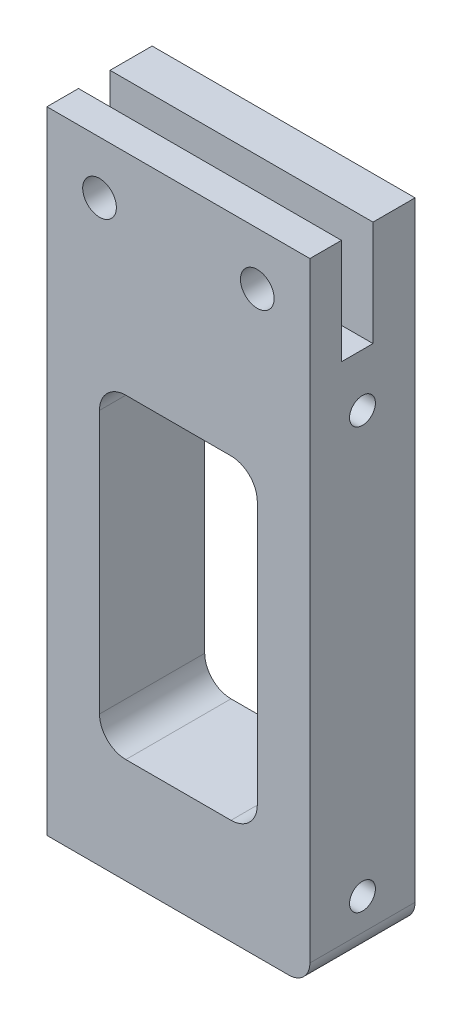
ISO-10303-21;
HEADER;
FILE_DESCRIPTION(('STEP AP214'),'2;1');
FILE_NAME('part.step','',(''),(''),'','','');
FILE_SCHEMA(('AUTOMOTIVE_DESIGN { 1 0 10303 214 1 1 1 1 }'));
ENDSEC;
DATA;
#1=APPLICATION_CONTEXT('core data for automotive mechanical design processes');
#2=APPLICATION_PROTOCOL_DEFINITION('international standard','automotive_design',2000,#1);
#3=PRODUCT_CONTEXT('',#1,'mechanical');
#4=PRODUCT('Part','Part','',(#3));
#5=PRODUCT_RELATED_PRODUCT_CATEGORY('part','',(#4));
#6=PRODUCT_DEFINITION_FORMATION('','',#4);
#7=PRODUCT_DEFINITION_CONTEXT('part definition',#1,'design');
#8=PRODUCT_DEFINITION('design','',#6,#7);
#9=PRODUCT_DEFINITION_SHAPE('','',#8);
#10=(LENGTH_UNIT() NAMED_UNIT(*) SI_UNIT(.MILLI.,.METRE.));
#11=(NAMED_UNIT(*) PLANE_ANGLE_UNIT() SI_UNIT($,.RADIAN.));
#12=(NAMED_UNIT(*) SI_UNIT($,.STERADIAN.) SOLID_ANGLE_UNIT());
#13=UNCERTAINTY_MEASURE_WITH_UNIT(LENGTH_MEASURE(1.E-05),#10,'distance_accuracy_value','');
#14=(GEOMETRIC_REPRESENTATION_CONTEXT(3) GLOBAL_UNCERTAINTY_ASSIGNED_CONTEXT((#13)) GLOBAL_UNIT_ASSIGNED_CONTEXT((#10,
#11,#12)) REPRESENTATION_CONTEXT('',''));
#15=CARTESIAN_POINT('',(0.,0.,0.));
#16=DIRECTION('',(0.,0.,1.));
#17=DIRECTION('',(1.,0.,0.));
#18=AXIS2_PLACEMENT_3D('',#15,#16,#17);
#19=CARTESIAN_POINT('',(2.50000000073669,20.,5.));
#20=DIRECTION('',(1.,0.,0.));
#21=DIRECTION('',(0.,1.,0.));
#22=AXIS2_PLACEMENT_3D('',#19,#20,#21);
#23=CONICAL_SURFACE('',#22,1.22949999951516,1.02974425728244);
#24=CARTESIAN_POINT('',(1.76124186782545,20.,5.00000000022283));
#25=VERTEX_POINT('',#24);
#26=VERTEX_LOOP('',#25);
#27=FACE_BOUND('',#26,.T.);
#28=CARTESIAN_POINT('',(2.49999999999999,20.,5.));
#29=DIRECTION('',(1.,0.,0.));
#30=DIRECTION('',(0.,1.,0.));
#31=AXIS2_PLACEMENT_3D('',#28,#29,#30);
#32=CIRCLE('',#31,1.2295);
#33=CARTESIAN_POINT('',(2.49999999999999,21.2295,5.));
#34=VERTEX_POINT('',#33);
#35=EDGE_CURVE('E157',#34,#34,#32,.T.);
#36=ORIENTED_EDGE('',*,*,#35,.T.);
#37=EDGE_LOOP('',(#36));
#38=FACE_BOUND('',#37,.T.);
#39=ADVANCED_FACE('F17',(#27,#38),#23,.F.);
#40=CARTESIAN_POINT('',(2.50000000073669,-20.,5.));
#41=DIRECTION('',(1.,0.,0.));
#42=DIRECTION('',(0.,1.,0.));
#43=AXIS2_PLACEMENT_3D('',#40,#41,#42);
#44=CONICAL_SURFACE('',#43,1.22949999951516,1.02974425728244);
#45=CARTESIAN_POINT('',(1.76124186782545,-20.,5.00000000022283));
#46=VERTEX_POINT('',#45);
#47=VERTEX_LOOP('',#46);
#48=FACE_BOUND('',#47,.T.);
#49=CARTESIAN_POINT('',(2.5,-20.,5.));
#50=DIRECTION('',(1.,0.,0.));
#51=DIRECTION('',(0.,1.,0.));
#52=AXIS2_PLACEMENT_3D('',#49,#50,#51);
#53=CIRCLE('',#52,1.2295);
#54=CARTESIAN_POINT('',(2.5,-18.7705,5.));
#55=VERTEX_POINT('',#54);
#56=EDGE_CURVE('E159',#55,#55,#53,.T.);
#57=ORIENTED_EDGE('',*,*,#56,.T.);
#58=EDGE_LOOP('',(#57));
#59=FACE_BOUND('',#58,.T.);
#60=ADVANCED_FACE('F154',(#48,#59),#44,.F.);
#61=CARTESIAN_POINT('',(-7.49999999999999,-15.0000000007253,5.));
#62=DIRECTION('',(0.,-1.,0.));
#63=DIRECTION('',(0.,0.,-1.));
#64=AXIS2_PLACEMENT_3D('',#61,#62,#63);
#65=CONICAL_SURFACE('',#64,1.22949999963111,1.02974425751025);
#66=CARTESIAN_POINT('',(-7.49999999987949,-14.2612418679846,5.));
#67=VERTEX_POINT('',#66);
#68=VERTEX_LOOP('',#67);
#69=FACE_BOUND('',#68,.T.);
#70=CARTESIAN_POINT('',(-7.49999999999999,-15.,5.));
#71=DIRECTION('',(0.,-1.,0.));
#72=DIRECTION('',(0.,0.,-1.));
#73=AXIS2_PLACEMENT_3D('',#70,#71,#72);
#74=CIRCLE('',#73,1.2295);
#75=CARTESIAN_POINT('',(-7.49999999999999,-15.,3.7705));
#76=VERTEX_POINT('',#75);
#77=EDGE_CURVE('E297',#76,#76,#74,.T.);
#78=ORIENTED_EDGE('',*,*,#77,.T.);
#79=EDGE_LOOP('',(#78));
#80=FACE_BOUND('',#79,.T.);
#81=ADVANCED_FACE('F672',(#69,#80),#65,.F.);
#82=CARTESIAN_POINT('',(-7.50000000000001,30.,7.));
#83=DIRECTION('',(0.,0.,1.));
#84=DIRECTION('',(1.,0.,0.));
#85=AXIS2_PLACEMENT_3D('',#82,#83,#84);
#86=CYLINDRICAL_SURFACE('',#85,1.6);
#87=CARTESIAN_POINT('',(-7.50000000000001,30.,10.));
#88=DIRECTION('',(0.,0.,1.));
#89=DIRECTION('',(1.,0.,0.));
#90=AXIS2_PLACEMENT_3D('',#87,#88,#89);
#91=CIRCLE('',#90,1.6);
#92=CARTESIAN_POINT('',(-5.90000000000001,30.,10.));
#93=VERTEX_POINT('',#92);
#94=EDGE_CURVE('E246',#93,#93,#91,.F.);
#95=ORIENTED_EDGE('',*,*,#94,.F.);
#96=EDGE_LOOP('',(#95));
#97=FACE_BOUND('',#96,.T.);
#98=CARTESIAN_POINT('',(-7.50000000000001,30.,7.));
#99=DIRECTION('',(0.,0.,1.));
#100=DIRECTION('',(1.,0.,0.));
#101=AXIS2_PLACEMENT_3D('',#98,#99,#100);
#102=CIRCLE('',#101,1.6);
#103=CARTESIAN_POINT('',(-5.90000000000001,30.,7.));
#104=VERTEX_POINT('',#103);
#105=EDGE_CURVE('E20',#104,#104,#102,.F.);
#106=ORIENTED_EDGE('',*,*,#105,.T.);
#107=EDGE_LOOP('',(#106));
#108=FACE_BOUND('',#107,.T.);
#109=ADVANCED_FACE('F260',(#97,#108),#86,.F.);
#110=CARTESIAN_POINT('',(7.49999999999999,30.,7.));
#111=DIRECTION('',(0.,0.,1.));
#112=DIRECTION('',(1.,0.,0.));
#113=AXIS2_PLACEMENT_3D('',#110,#111,#112);
#114=CYLINDRICAL_SURFACE('',#113,1.6);
#115=CARTESIAN_POINT('',(7.49999999999999,30.,10.));
#116=DIRECTION('',(0.,0.,1.));
#117=DIRECTION('',(1.,0.,0.));
#118=AXIS2_PLACEMENT_3D('',#115,#116,#117);
#119=CIRCLE('',#118,1.6);
#120=CARTESIAN_POINT('',(9.09999999999999,30.,10.));
#121=VERTEX_POINT('',#120);
#122=EDGE_CURVE('E242',#121,#121,#119,.F.);
#123=ORIENTED_EDGE('',*,*,#122,.F.);
#124=EDGE_LOOP('',(#123));
#125=FACE_BOUND('',#124,.T.);
#126=CARTESIAN_POINT('',(7.49999999999999,30.,7.));
#127=DIRECTION('',(0.,0.,1.));
#128=DIRECTION('',(1.,0.,0.));
#129=AXIS2_PLACEMENT_3D('',#126,#127,#128);
#130=CIRCLE('',#129,1.6);
#131=CARTESIAN_POINT('',(9.09999999999999,30.,7.));
#132=VERTEX_POINT('',#131);
#133=EDGE_CURVE('E249',#132,#132,#130,.F.);
#134=ORIENTED_EDGE('',*,*,#133,.T.);
#135=EDGE_LOOP('',(#134));
#136=FACE_BOUND('',#135,.T.);
#137=ADVANCED_FACE('F656',(#125,#136),#114,.F.);
#138=CARTESIAN_POINT('',(7.49999999999999,20.,5.));
#139=DIRECTION('',(1.,0.,0.));
#140=DIRECTION('',(0.,1.,0.));
#141=AXIS2_PLACEMENT_3D('',#138,#139,#140);
#142=CYLINDRICAL_SURFACE('',#141,1.2295);
#143=ORIENTED_EDGE('',*,*,#35,.F.);
#144=EDGE_LOOP('',(#143));
#145=FACE_BOUND('',#144,.T.);
#146=CARTESIAN_POINT('',(12.5,20.,5.));
#147=DIRECTION('',(1.,0.,0.));
#148=DIRECTION('',(0.,1.,0.));
#149=AXIS2_PLACEMENT_3D('',#146,#147,#148);
#150=CIRCLE('',#149,1.2295);
#151=CARTESIAN_POINT('',(12.5,21.2295,5.));
#152=VERTEX_POINT('',#151);
#153=EDGE_CURVE('E239',#152,#152,#150,.F.);
#154=ORIENTED_EDGE('',*,*,#153,.F.);
#155=EDGE_LOOP('',(#154));
#156=FACE_BOUND('',#155,.T.);
#157=ADVANCED_FACE('F647',(#145,#156),#142,.F.);
#158=CARTESIAN_POINT('',(7.5,-20.,5.));
#159=DIRECTION('',(1.,0.,0.));
#160=DIRECTION('',(0.,1.,0.));
#161=AXIS2_PLACEMENT_3D('',#158,#159,#160);
#162=CYLINDRICAL_SURFACE('',#161,1.2295);
#163=ORIENTED_EDGE('',*,*,#56,.F.);
#164=EDGE_LOOP('',(#163));
#165=FACE_BOUND('',#164,.T.);
#166=CARTESIAN_POINT('',(12.5,-20.,5.));
#167=DIRECTION('',(1.,0.,0.));
#168=DIRECTION('',(0.,1.,0.));
#169=AXIS2_PLACEMENT_3D('',#166,#167,#168);
#170=CIRCLE('',#169,1.2295);
#171=CARTESIAN_POINT('',(12.5,-18.7705,5.));
#172=VERTEX_POINT('',#171);
#173=EDGE_CURVE('E235',#172,#172,#170,.F.);
#174=ORIENTED_EDGE('',*,*,#173,.F.);
#175=EDGE_LOOP('',(#174));
#176=FACE_BOUND('',#175,.T.);
#177=ADVANCED_FACE('F266',(#165,#176),#162,.F.);
#178=CARTESIAN_POINT('',(-12.5,25.,7.));
#179=DIRECTION('',(0.,0.,1.));
#180=DIRECTION('',(1.,0.,0.));
#181=AXIS2_PLACEMENT_3D('',#178,#179,#180);
#182=PLANE('',#181);
#183=ORIENTED_EDGE('',*,*,#133,.F.);
#184=EDGE_LOOP('',(#183));
#185=FACE_BOUND('',#184,.T.);
#186=ORIENTED_EDGE('',*,*,#105,.F.);
#187=EDGE_LOOP('',(#186));
#188=FACE_BOUND('',#187,.T.);
#189=DIRECTION('',(1.,0.,0.));
#190=VECTOR('',#189,1.);
#191=CARTESIAN_POINT('',(-12.5,25.,7.));
#192=LINE('',#191,#190);
#193=CARTESIAN_POINT('',(12.5,25.,7.));
#194=VERTEX_POINT('',#193);
#195=CARTESIAN_POINT('',(-12.5,25.,7.));
#196=VERTEX_POINT('',#195);
#197=EDGE_CURVE('E251',#194,#196,#192,.F.);
#198=ORIENTED_EDGE('',*,*,#197,.T.);
#199=DIRECTION('',(0.,1.,0.));
#200=VECTOR('',#199,1.);
#201=CARTESIAN_POINT('',(-12.5,-25.,7.));
#202=LINE('',#201,#200);
#203=CARTESIAN_POINT('',(-12.5,35.,7.));
#204=VERTEX_POINT('',#203);
#205=EDGE_CURVE('E273',#204,#196,#202,.F.);
#206=ORIENTED_EDGE('',*,*,#205,.F.);
#207=DIRECTION('',(1.,0.,0.));
#208=VECTOR('',#207,1.);
#209=CARTESIAN_POINT('',(-12.5,35.,7.));
#210=LINE('',#209,#208);
#211=CARTESIAN_POINT('',(12.5,35.,7.));
#212=VERTEX_POINT('',#211);
#213=EDGE_CURVE('E255',#212,#204,#210,.F.);
#214=ORIENTED_EDGE('',*,*,#213,.F.);
#215=DIRECTION('',(0.,1.,0.));
#216=VECTOR('',#215,1.);
#217=CARTESIAN_POINT('',(12.5,35.,7.));
#218=LINE('',#217,#216);
#219=EDGE_CURVE('E170',#194,#212,#218,.T.);
#220=ORIENTED_EDGE('',*,*,#219,.F.);
#221=EDGE_LOOP('',(#198,#206,#214,#220));
#222=FACE_BOUND('',#221,.T.);
#223=ADVANCED_FACE('F262',(#185,#188,#222),#182,.F.);
#224=CARTESIAN_POINT('',(-12.5,25.,4.));
#225=DIRECTION('',(0.,-1.,0.));
#226=DIRECTION('',(0.,0.,-1.));
#227=AXIS2_PLACEMENT_3D('',#224,#225,#226);
#228=PLANE('',#227);
#229=DIRECTION('',(-1.,0.,0.));
#230=VECTOR('',#229,1.);
#231=CARTESIAN_POINT('',(-12.5,25.,4.));
#232=LINE('',#231,#230);
#233=CARTESIAN_POINT('',(12.5,25.,4.));
#234=VERTEX_POINT('',#233);
#235=CARTESIAN_POINT('',(-12.5,25.,4.));
#236=VERTEX_POINT('',#235);
#237=EDGE_CURVE('E245',#234,#236,#232,.T.);
#238=ORIENTED_EDGE('',*,*,#237,.T.);
#239=DIRECTION('',(0.,0.,1.));
#240=VECTOR('',#239,1.);
#241=CARTESIAN_POINT('',(-12.5,25.,0.));
#242=LINE('',#241,#240);
#243=EDGE_CURVE('E277',#196,#236,#242,.F.);
#244=ORIENTED_EDGE('',*,*,#243,.F.);
#245=ORIENTED_EDGE('',*,*,#197,.F.);
#246=DIRECTION('',(0.,0.,-1.));
#247=VECTOR('',#246,1.);
#248=CARTESIAN_POINT('',(12.5,25.,0.));
#249=LINE('',#248,#247);
#250=EDGE_CURVE('E174',#234,#194,#249,.F.);
#251=ORIENTED_EDGE('',*,*,#250,.F.);
#252=EDGE_LOOP('',(#238,#244,#245,#251));
#253=FACE_BOUND('',#252,.T.);
#254=ADVANCED_FACE('F265',(#253),#228,.F.);
#255=CARTESIAN_POINT('',(-12.5,35.,0.));
#256=DIRECTION('',(0.,1.,0.));
#257=DIRECTION('',(0.,0.,1.));
#258=AXIS2_PLACEMENT_3D('',#255,#256,#257);
#259=PLANE('',#258);
#260=DIRECTION('',(1.,0.,0.));
#261=VECTOR('',#260,1.);
#262=CARTESIAN_POINT('',(0.,35.,10.));
#263=LINE('',#262,#261);
#264=CARTESIAN_POINT('',(12.5,35.,10.));
#265=VERTEX_POINT('',#264);
#266=CARTESIAN_POINT('',(-12.5,35.,10.));
#267=VERTEX_POINT('',#266);
#268=EDGE_CURVE('E248',#265,#267,#263,.F.);
#269=ORIENTED_EDGE('',*,*,#268,.F.);
#270=DIRECTION('',(0.,0.,-1.));
#271=VECTOR('',#270,1.);
#272=CARTESIAN_POINT('',(12.5,35.,0.));
#273=LINE('',#272,#271);
#274=EDGE_CURVE('E168',#212,#265,#273,.F.);
#275=ORIENTED_EDGE('',*,*,#274,.F.);
#276=ORIENTED_EDGE('',*,*,#213,.T.);
#277=DIRECTION('',(0.,0.,1.));
#278=VECTOR('',#277,1.);
#279=CARTESIAN_POINT('',(-12.5,35.,0.));
#280=LINE('',#279,#278);
#281=EDGE_CURVE('E313',#267,#204,#280,.F.);
#282=ORIENTED_EDGE('',*,*,#281,.F.);
#283=EDGE_LOOP('',(#269,#275,#276,#282));
#284=FACE_BOUND('',#283,.T.);
#285=ADVANCED_FACE('F618',(#284),#259,.T.);
#286=CARTESIAN_POINT('',(-7.49999999999999,-20.,5.));
#287=DIRECTION('',(0.,-1.,0.));
#288=DIRECTION('',(0.,0.,-1.));
#289=AXIS2_PLACEMENT_3D('',#286,#287,#288);
#290=CYLINDRICAL_SURFACE('',#289,1.2295);
#291=ORIENTED_EDGE('',*,*,#77,.F.);
#292=EDGE_LOOP('',(#291));
#293=FACE_BOUND('',#292,.T.);
#294=CARTESIAN_POINT('',(-7.49999999999999,-25.,5.));
#295=DIRECTION('',(0.,-1.,0.));
#296=DIRECTION('',(0.,0.,-1.));
#297=AXIS2_PLACEMENT_3D('',#294,#295,#296);
#298=CIRCLE('',#297,1.2295);
#299=CARTESIAN_POINT('',(-7.49999999999999,-25.,3.7705));
#300=VERTEX_POINT('',#299);
#301=EDGE_CURVE('E231',#300,#300,#298,.F.);
#302=ORIENTED_EDGE('',*,*,#301,.F.);
#303=EDGE_LOOP('',(#302));
#304=FACE_BOUND('',#303,.T.);
#305=ADVANCED_FACE('F428',(#293,#304),#290,.F.);
#306=CARTESIAN_POINT('',(0.,5.,10.));
#307=DIRECTION('',(0.,0.,1.));
#308=DIRECTION('',(1.,0.,0.));
#309=AXIS2_PLACEMENT_3D('',#306,#307,#308);
#310=PLANE('',#309);
#311=DIRECTION('',(0.,1.,0.));
#312=VECTOR('',#311,1.);
#313=CARTESIAN_POINT('',(-7.5,-12.5,10.));
#314=LINE('',#313,#312);
#315=CARTESIAN_POINT('',(-7.5,-12.5,10.));
#316=VERTEX_POINT('',#315);
#317=CARTESIAN_POINT('',(-7.5,12.5,10.));
#318=VERTEX_POINT('',#317);
#319=EDGE_CURVE('E338',#316,#318,#314,.T.);
#320=ORIENTED_EDGE('',*,*,#319,.T.);
#321=CARTESIAN_POINT('',(-5.00000000000001,12.5,10.));
#322=DIRECTION('',(0.,0.,1.));
#323=DIRECTION('',(1.,0.,0.));
#324=AXIS2_PLACEMENT_3D('',#321,#322,#323);
#325=CIRCLE('',#324,2.5);
#326=CARTESIAN_POINT('',(-5.00000000000001,15.,10.));
#327=VERTEX_POINT('',#326);
#328=EDGE_CURVE('E212',#318,#327,#325,.F.);
#329=ORIENTED_EDGE('',*,*,#328,.T.);
#330=DIRECTION('',(1.,0.,0.));
#331=VECTOR('',#330,1.);
#332=CARTESIAN_POINT('',(-5.00000000000001,15.,10.));
#333=LINE('',#332,#331);
#334=CARTESIAN_POINT('',(4.99999999999999,15.,10.));
#335=VERTEX_POINT('',#334);
#336=EDGE_CURVE('E211',#327,#335,#333,.T.);
#337=ORIENTED_EDGE('',*,*,#336,.T.);
#338=CARTESIAN_POINT('',(5.,12.5,10.));
#339=DIRECTION('',(0.,0.,1.));
#340=DIRECTION('',(1.,0.,0.));
#341=AXIS2_PLACEMENT_3D('',#338,#339,#340);
#342=CIRCLE('',#341,2.5);
#343=CARTESIAN_POINT('',(7.5,12.5,10.));
#344=VERTEX_POINT('',#343);
#345=EDGE_CURVE('E224',#335,#344,#342,.F.);
#346=ORIENTED_EDGE('',*,*,#345,.T.);
#347=DIRECTION('',(0.,1.,0.));
#348=VECTOR('',#347,1.);
#349=CARTESIAN_POINT('',(7.5,12.5,10.));
#350=LINE('',#349,#348);
#351=CARTESIAN_POINT('',(7.5,-12.5,10.));
#352=VERTEX_POINT('',#351);
#353=EDGE_CURVE('E334',#344,#352,#350,.F.);
#354=ORIENTED_EDGE('',*,*,#353,.T.);
#355=CARTESIAN_POINT('',(5.00000000000001,-12.5,10.));
#356=DIRECTION('',(0.,0.,1.));
#357=DIRECTION('',(1.,0.,0.));
#358=AXIS2_PLACEMENT_3D('',#355,#356,#357);
#359=CIRCLE('',#358,2.49999999999999);
#360=CARTESIAN_POINT('',(5.00000000000001,-15.,10.));
#361=VERTEX_POINT('',#360);
#362=EDGE_CURVE('E220',#352,#361,#359,.F.);
#363=ORIENTED_EDGE('',*,*,#362,.T.);
#364=DIRECTION('',(1.,0.,0.));
#365=VECTOR('',#364,1.);
#366=CARTESIAN_POINT('',(5.00000000000001,-15.,10.));
#367=LINE('',#366,#365);
#368=CARTESIAN_POINT('',(-5.,-15.,10.));
#369=VERTEX_POINT('',#368);
#370=EDGE_CURVE('E336',#361,#369,#367,.F.);
#371=ORIENTED_EDGE('',*,*,#370,.T.);
#372=CARTESIAN_POINT('',(-5.,-12.5,10.));
#373=DIRECTION('',(0.,0.,1.));
#374=DIRECTION('',(1.,0.,0.));
#375=AXIS2_PLACEMENT_3D('',#372,#373,#374);
#376=CIRCLE('',#375,2.5);
#377=EDGE_CURVE('E216',#369,#316,#376,.F.);
#378=ORIENTED_EDGE('',*,*,#377,.T.);
#379=EDGE_LOOP('',(#320,#329,#337,#346,#354,#363,#371,#378));
#380=FACE_BOUND('',#379,.T.);
#381=ORIENTED_EDGE('',*,*,#122,.T.);
#382=EDGE_LOOP('',(#381));
#383=FACE_BOUND('',#382,.T.);
#384=ORIENTED_EDGE('',*,*,#94,.T.);
#385=EDGE_LOOP('',(#384));
#386=FACE_BOUND('',#385,.T.);
#387=DIRECTION('',(0.,1.,0.));
#388=VECTOR('',#387,1.);
#389=CARTESIAN_POINT('',(-12.5,-25.,10.));
#390=LINE('',#389,#388);
#391=CARTESIAN_POINT('',(-12.5,-25.,10.));
#392=VERTEX_POINT('',#391);
#393=EDGE_CURVE('E316',#392,#267,#390,.T.);
#394=ORIENTED_EDGE('',*,*,#393,.F.);
#395=DIRECTION('',(1.,0.,0.));
#396=VECTOR('',#395,1.);
#397=CARTESIAN_POINT('',(12.5,-25.,10.));
#398=LINE('',#397,#396);
#399=CARTESIAN_POINT('',(10.5,-25.,10.));
#400=VERTEX_POINT('',#399);
#401=EDGE_CURVE('E107',#400,#392,#398,.F.);
#402=ORIENTED_EDGE('',*,*,#401,.F.);
#403=CARTESIAN_POINT('',(10.5,-23.,10.));
#404=DIRECTION('',(0.,0.,1.));
#405=DIRECTION('',(1.,0.,0.));
#406=AXIS2_PLACEMENT_3D('',#403,#404,#405);
#407=CIRCLE('',#406,2.);
#408=CARTESIAN_POINT('',(12.5,-23.,10.));
#409=VERTEX_POINT('',#408);
#410=EDGE_CURVE('E228',#409,#400,#407,.F.);
#411=ORIENTED_EDGE('',*,*,#410,.F.);
#412=DIRECTION('',(0.,1.,0.));
#413=VECTOR('',#412,1.);
#414=CARTESIAN_POINT('',(12.5,35.,10.));
#415=LINE('',#414,#413);
#416=EDGE_CURVE('E97',#265,#409,#415,.F.);
#417=ORIENTED_EDGE('',*,*,#416,.F.);
#418=ORIENTED_EDGE('',*,*,#268,.T.);
#419=EDGE_LOOP('',(#394,#402,#411,#417,#418));
#420=FACE_BOUND('',#419,.T.);
#421=ADVANCED_FACE('F424',(#380,#383,#386,#420),#310,.T.);
#422=CARTESIAN_POINT('',(-12.5,35.,4.));
#423=DIRECTION('',(0.,0.,-1.));
#424=DIRECTION('',(-1.,0.,0.));
#425=AXIS2_PLACEMENT_3D('',#422,#423,#424);
#426=PLANE('',#425);
#427=CARTESIAN_POINT('',(7.49999999999999,30.,4.));
#428=DIRECTION('',(0.,0.,1.));
#429=DIRECTION('',(1.,0.,0.));
#430=AXIS2_PLACEMENT_3D('',#427,#428,#429);
#431=CIRCLE('',#430,1.2295);
#432=CARTESIAN_POINT('',(8.72949999999999,30.,4.));
#433=VERTEX_POINT('',#432);
#434=EDGE_CURVE('E208',#433,#433,#431,.F.);
#435=ORIENTED_EDGE('',*,*,#434,.T.);
#436=EDGE_LOOP('',(#435));
#437=FACE_BOUND('',#436,.T.);
#438=CARTESIAN_POINT('',(-7.50000000000001,30.,4.));
#439=DIRECTION('',(0.,0.,1.));
#440=DIRECTION('',(1.,0.,0.));
#441=AXIS2_PLACEMENT_3D('',#438,#439,#440);
#442=CIRCLE('',#441,1.2295);
#443=CARTESIAN_POINT('',(-6.27050000000001,30.,4.));
#444=VERTEX_POINT('',#443);
#445=EDGE_CURVE('E204',#444,#444,#442,.F.);
#446=ORIENTED_EDGE('',*,*,#445,.T.);
#447=EDGE_LOOP('',(#446));
#448=FACE_BOUND('',#447,.T.);
#449=DIRECTION('',(1.,0.,0.));
#450=VECTOR('',#449,1.);
#451=CARTESIAN_POINT('',(-12.5,35.,4.));
#452=LINE('',#451,#450);
#453=CARTESIAN_POINT('',(-12.5,35.,4.));
#454=VERTEX_POINT('',#453);
#455=CARTESIAN_POINT('',(12.5,35.,4.));
#456=VERTEX_POINT('',#455);
#457=EDGE_CURVE('E238',#454,#456,#452,.T.);
#458=ORIENTED_EDGE('',*,*,#457,.F.);
#459=DIRECTION('',(0.,1.,0.));
#460=VECTOR('',#459,1.);
#461=CARTESIAN_POINT('',(-12.5,-25.,4.));
#462=LINE('',#461,#460);
#463=EDGE_CURVE('E280',#236,#454,#462,.T.);
#464=ORIENTED_EDGE('',*,*,#463,.F.);
#465=ORIENTED_EDGE('',*,*,#237,.F.);
#466=DIRECTION('',(0.,1.,0.));
#467=VECTOR('',#466,1.);
#468=CARTESIAN_POINT('',(12.5,35.,4.));
#469=LINE('',#468,#467);
#470=EDGE_CURVE('E179',#456,#234,#469,.F.);
#471=ORIENTED_EDGE('',*,*,#470,.F.);
#472=EDGE_LOOP('',(#458,#464,#465,#471));
#473=FACE_BOUND('',#472,.T.);
#474=ADVANCED_FACE('F427',(#437,#448,#473),#426,.F.);
#475=CARTESIAN_POINT('',(12.5,35.,0.));
#476=DIRECTION('',(1.,0.,0.));
#477=DIRECTION('',(0.,0.,-1.));
#478=AXIS2_PLACEMENT_3D('',#475,#476,#477);
#479=PLANE('',#478);
#480=ORIENTED_EDGE('',*,*,#173,.T.);
#481=EDGE_LOOP('',(#480));
#482=FACE_BOUND('',#481,.T.);
#483=ORIENTED_EDGE('',*,*,#153,.T.);
#484=EDGE_LOOP('',(#483));
#485=FACE_BOUND('',#484,.T.);
#486=ORIENTED_EDGE('',*,*,#274,.T.);
#487=ORIENTED_EDGE('',*,*,#416,.T.);
#488=DIRECTION('',(0.,0.,1.));
#489=VECTOR('',#488,1.);
#490=CARTESIAN_POINT('',(12.5,-23.,0.));
#491=LINE('',#490,#489);
#492=CARTESIAN_POINT('',(12.5,-23.,0.));
#493=VERTEX_POINT('',#492);
#494=EDGE_CURVE('E227',#493,#409,#491,.T.);
#495=ORIENTED_EDGE('',*,*,#494,.F.);
#496=DIRECTION('',(0.,1.,0.));
#497=VECTOR('',#496,1.);
#498=CARTESIAN_POINT('',(12.5,5.,0.));
#499=LINE('',#498,#497);
#500=CARTESIAN_POINT('',(12.5,35.,0.));
#501=VERTEX_POINT('',#500);
#502=EDGE_CURVE('E207',#493,#501,#499,.T.);
#503=ORIENTED_EDGE('',*,*,#502,.T.);
#504=DIRECTION('',(0.,0.,1.));
#505=VECTOR('',#504,1.);
#506=CARTESIAN_POINT('',(12.5,35.,0.));
#507=LINE('',#506,#505);
#508=EDGE_CURVE('E284',#456,#501,#507,.F.);
#509=ORIENTED_EDGE('',*,*,#508,.F.);
#510=ORIENTED_EDGE('',*,*,#470,.T.);
#511=ORIENTED_EDGE('',*,*,#250,.T.);
#512=ORIENTED_EDGE('',*,*,#219,.T.);
#513=EDGE_LOOP('',(#486,#487,#495,#503,#509,#510,#511,#512));
#514=FACE_BOUND('',#513,.T.);
#515=ADVANCED_FACE('F446',(#482,#485,#514),#479,.T.);
#516=CARTESIAN_POINT('',(-12.5,35.,0.));
#517=DIRECTION('',(0.,1.,0.));
#518=DIRECTION('',(0.,0.,1.));
#519=AXIS2_PLACEMENT_3D('',#516,#517,#518);
#520=PLANE('',#519);
#521=DIRECTION('',(1.,0.,0.));
#522=VECTOR('',#521,1.);
#523=CARTESIAN_POINT('',(0.,35.,0.));
#524=LINE('',#523,#522);
#525=CARTESIAN_POINT('',(-12.5,35.,0.));
#526=VERTEX_POINT('',#525);
#527=EDGE_CURVE('E347',#501,#526,#524,.F.);
#528=ORIENTED_EDGE('',*,*,#527,.T.);
#529=DIRECTION('',(0.,0.,1.));
#530=VECTOR('',#529,1.);
#531=CARTESIAN_POINT('',(-12.5,35.,0.));
#532=LINE('',#531,#530);
#533=EDGE_CURVE('E282',#454,#526,#532,.F.);
#534=ORIENTED_EDGE('',*,*,#533,.F.);
#535=ORIENTED_EDGE('',*,*,#457,.T.);
#536=ORIENTED_EDGE('',*,*,#508,.T.);
#537=EDGE_LOOP('',(#528,#534,#535,#536));
#538=FACE_BOUND('',#537,.T.);
#539=ADVANCED_FACE('F448',(#538),#520,.T.);
#540=CARTESIAN_POINT('',(-12.5,-25.,0.));
#541=DIRECTION('',(-1.,0.,0.));
#542=DIRECTION('',(0.,0.,1.));
#543=AXIS2_PLACEMENT_3D('',#540,#541,#542);
#544=PLANE('',#543);
#545=ORIENTED_EDGE('',*,*,#393,.T.);
#546=ORIENTED_EDGE('',*,*,#281,.T.);
#547=ORIENTED_EDGE('',*,*,#205,.T.);
#548=ORIENTED_EDGE('',*,*,#243,.T.);
#549=ORIENTED_EDGE('',*,*,#463,.T.);
#550=ORIENTED_EDGE('',*,*,#533,.T.);
#551=DIRECTION('',(0.,1.,0.));
#552=VECTOR('',#551,1.);
#553=CARTESIAN_POINT('',(-12.5,5.,0.));
#554=LINE('',#553,#552);
#555=CARTESIAN_POINT('',(-12.5,-25.,0.));
#556=VERTEX_POINT('',#555);
#557=EDGE_CURVE('E350',#526,#556,#554,.F.);
#558=ORIENTED_EDGE('',*,*,#557,.T.);
#559=DIRECTION('',(0.,0.,-1.));
#560=VECTOR('',#559,1.);
#561=CARTESIAN_POINT('',(-12.5,-25.,0.));
#562=LINE('',#561,#560);
#563=EDGE_CURVE('E234',#392,#556,#562,.T.);
#564=ORIENTED_EDGE('',*,*,#563,.F.);
#565=EDGE_LOOP('',(#545,#546,#547,#548,#549,#550,#558,#564));
#566=FACE_BOUND('',#565,.T.);
#567=ADVANCED_FACE('F438',(#566),#544,.T.);
#568=CARTESIAN_POINT('',(12.5,-25.,0.));
#569=DIRECTION('',(0.,-1.,0.));
#570=DIRECTION('',(0.,0.,-1.));
#571=AXIS2_PLACEMENT_3D('',#568,#569,#570);
#572=PLANE('',#571);
#573=ORIENTED_EDGE('',*,*,#301,.T.);
#574=EDGE_LOOP('',(#573));
#575=FACE_BOUND('',#574,.T.);
#576=ORIENTED_EDGE('',*,*,#563,.T.);
#577=DIRECTION('',(1.,0.,0.));
#578=VECTOR('',#577,1.);
#579=CARTESIAN_POINT('',(0.,-25.,0.));
#580=LINE('',#579,#578);
#581=CARTESIAN_POINT('',(10.5,-25.,0.));
#582=VERTEX_POINT('',#581);
#583=EDGE_CURVE('E203',#556,#582,#580,.T.);
#584=ORIENTED_EDGE('',*,*,#583,.T.);
#585=DIRECTION('',(0.,0.,1.));
#586=VECTOR('',#585,1.);
#587=CARTESIAN_POINT('',(10.5,-25.,0.));
#588=LINE('',#587,#586);
#589=EDGE_CURVE('E230',#400,#582,#588,.F.);
#590=ORIENTED_EDGE('',*,*,#589,.F.);
#591=ORIENTED_EDGE('',*,*,#401,.T.);
#592=EDGE_LOOP('',(#576,#584,#590,#591));
#593=FACE_BOUND('',#592,.T.);
#594=ADVANCED_FACE('F441',(#575,#593),#572,.T.);
#595=CARTESIAN_POINT('',(10.5,-23.,0.));
#596=DIRECTION('',(0.,0.,1.));
#597=DIRECTION('',(1.,0.,0.));
#598=AXIS2_PLACEMENT_3D('',#595,#596,#597);
#599=CYLINDRICAL_SURFACE('',#598,2.);
#600=CARTESIAN_POINT('',(10.5,-23.,0.));
#601=DIRECTION('',(0.,0.,1.));
#602=DIRECTION('',(1.,0.,0.));
#603=AXIS2_PLACEMENT_3D('',#600,#601,#602);
#604=CIRCLE('',#603,2.);
#605=EDGE_CURVE('E200',#582,#493,#604,.T.);
#606=ORIENTED_EDGE('',*,*,#605,.T.);
#607=ORIENTED_EDGE('',*,*,#494,.T.);
#608=ORIENTED_EDGE('',*,*,#410,.T.);
#609=ORIENTED_EDGE('',*,*,#589,.T.);
#610=EDGE_LOOP('',(#606,#607,#608,#609));
#611=FACE_BOUND('',#610,.T.);
#612=ADVANCED_FACE('F445',(#611),#599,.T.);
#613=CARTESIAN_POINT('',(5.,12.5,0.));
#614=DIRECTION('',(0.,0.,1.));
#615=DIRECTION('',(1.,0.,0.));
#616=AXIS2_PLACEMENT_3D('',#613,#614,#615);
#617=CYLINDRICAL_SURFACE('',#616,2.5);
#618=DIRECTION('',(0.,0.,1.));
#619=VECTOR('',#618,1.);
#620=CARTESIAN_POINT('',(4.99999999999999,15.,0.));
#621=LINE('',#620,#619);
#622=CARTESIAN_POINT('',(4.99999999999999,15.,0.));
#623=VERTEX_POINT('',#622);
#624=EDGE_CURVE('E214',#335,#623,#621,.F.);
#625=ORIENTED_EDGE('',*,*,#624,.T.);
#626=CARTESIAN_POINT('',(5.,12.5,0.));
#627=DIRECTION('',(0.,0.,1.));
#628=DIRECTION('',(1.,0.,0.));
#629=AXIS2_PLACEMENT_3D('',#626,#627,#628);
#630=CIRCLE('',#629,2.5);
#631=CARTESIAN_POINT('',(7.5,12.5,0.));
#632=VERTEX_POINT('',#631);
#633=EDGE_CURVE('E197',#623,#632,#630,.F.);
#634=ORIENTED_EDGE('',*,*,#633,.T.);
#635=DIRECTION('',(0.,0.,-1.));
#636=VECTOR('',#635,1.);
#637=CARTESIAN_POINT('',(7.5,12.5,0.));
#638=LINE('',#637,#636);
#639=EDGE_CURVE('E226',#632,#344,#638,.F.);
#640=ORIENTED_EDGE('',*,*,#639,.T.);
#641=ORIENTED_EDGE('',*,*,#345,.F.);
#642=EDGE_LOOP('',(#625,#634,#640,#641));
#643=FACE_BOUND('',#642,.T.);
#644=ADVANCED_FACE('F422',(#643),#617,.F.);
#645=CARTESIAN_POINT('',(7.5,12.5,0.));
#646=DIRECTION('',(1.,0.,0.));
#647=DIRECTION('',(0.,0.,-1.));
#648=AXIS2_PLACEMENT_3D('',#645,#646,#647);
#649=PLANE('',#648);
#650=ORIENTED_EDGE('',*,*,#639,.F.);
#651=DIRECTION('',(0.,1.,0.));
#652=VECTOR('',#651,1.);
#653=CARTESIAN_POINT('',(7.5,5.,0.));
#654=LINE('',#653,#652);
#655=CARTESIAN_POINT('',(7.5,-12.5,0.));
#656=VERTEX_POINT('',#655);
#657=EDGE_CURVE('E196',#632,#656,#654,.F.);
#658=ORIENTED_EDGE('',*,*,#657,.T.);
#659=DIRECTION('',(0.,0.,1.));
#660=VECTOR('',#659,1.);
#661=CARTESIAN_POINT('',(7.5,-12.5,0.));
#662=LINE('',#661,#660);
#663=EDGE_CURVE('E223',#656,#352,#662,.T.);
#664=ORIENTED_EDGE('',*,*,#663,.T.);
#665=ORIENTED_EDGE('',*,*,#353,.F.);
#666=EDGE_LOOP('',(#650,#658,#664,#665));
#667=FACE_BOUND('',#666,.T.);
#668=ADVANCED_FACE('F420',(#667),#649,.F.);
#669=CARTESIAN_POINT('',(5.00000000000001,-12.5,0.));
#670=DIRECTION('',(0.,0.,1.));
#671=DIRECTION('',(1.,0.,0.));
#672=AXIS2_PLACEMENT_3D('',#669,#670,#671);
#673=CYLINDRICAL_SURFACE('',#672,2.49999999999999);
#674=ORIENTED_EDGE('',*,*,#663,.F.);
#675=CARTESIAN_POINT('',(5.00000000000001,-12.5,0.));
#676=DIRECTION('',(0.,0.,1.));
#677=DIRECTION('',(1.,0.,0.));
#678=AXIS2_PLACEMENT_3D('',#675,#676,#677);
#679=CIRCLE('',#678,2.49999999999999);
#680=CARTESIAN_POINT('',(5.00000000000001,-15.,0.));
#681=VERTEX_POINT('',#680);
#682=EDGE_CURVE('E193',#656,#681,#679,.F.);
#683=ORIENTED_EDGE('',*,*,#682,.T.);
#684=DIRECTION('',(0.,0.,-1.));
#685=VECTOR('',#684,1.);
#686=CARTESIAN_POINT('',(5.00000000000001,-15.,0.));
#687=LINE('',#686,#685);
#688=EDGE_CURVE('E222',#681,#361,#687,.F.);
#689=ORIENTED_EDGE('',*,*,#688,.T.);
#690=ORIENTED_EDGE('',*,*,#362,.F.);
#691=EDGE_LOOP('',(#674,#683,#689,#690));
#692=FACE_BOUND('',#691,.T.);
#693=ADVANCED_FACE('F416',(#692),#673,.F.);
#694=CARTESIAN_POINT('',(5.00000000000001,-15.,0.));
#695=DIRECTION('',(0.,-1.,0.));
#696=DIRECTION('',(0.,0.,-1.));
#697=AXIS2_PLACEMENT_3D('',#694,#695,#696);
#698=PLANE('',#697);
#699=ORIENTED_EDGE('',*,*,#688,.F.);
#700=DIRECTION('',(1.,0.,0.));
#701=VECTOR('',#700,1.);
#702=CARTESIAN_POINT('',(0.,-15.,0.));
#703=LINE('',#702,#701);
#704=CARTESIAN_POINT('',(-5.,-15.,0.));
#705=VERTEX_POINT('',#704);
#706=EDGE_CURVE('E192',#681,#705,#703,.F.);
#707=ORIENTED_EDGE('',*,*,#706,.T.);
#708=DIRECTION('',(0.,0.,1.));
#709=VECTOR('',#708,1.);
#710=CARTESIAN_POINT('',(-5.,-15.,0.));
#711=LINE('',#710,#709);
#712=EDGE_CURVE('E219',#705,#369,#711,.T.);
#713=ORIENTED_EDGE('',*,*,#712,.T.);
#714=ORIENTED_EDGE('',*,*,#370,.F.);
#715=EDGE_LOOP('',(#699,#707,#713,#714));
#716=FACE_BOUND('',#715,.T.);
#717=ADVANCED_FACE('F413',(#716),#698,.F.);
#718=CARTESIAN_POINT('',(-5.,-12.5,0.));
#719=DIRECTION('',(0.,0.,1.));
#720=DIRECTION('',(1.,0.,0.));
#721=AXIS2_PLACEMENT_3D('',#718,#719,#720);
#722=CYLINDRICAL_SURFACE('',#721,2.5);
#723=ORIENTED_EDGE('',*,*,#712,.F.);
#724=CARTESIAN_POINT('',(-5.,-12.5,0.));
#725=DIRECTION('',(0.,0.,1.));
#726=DIRECTION('',(1.,0.,0.));
#727=AXIS2_PLACEMENT_3D('',#724,#725,#726);
#728=CIRCLE('',#727,2.5);
#729=CARTESIAN_POINT('',(-7.5,-12.5,0.));
#730=VERTEX_POINT('',#729);
#731=EDGE_CURVE('E189',#705,#730,#728,.F.);
#732=ORIENTED_EDGE('',*,*,#731,.T.);
#733=DIRECTION('',(0.,0.,1.));
#734=VECTOR('',#733,1.);
#735=CARTESIAN_POINT('',(-7.5,-12.5,0.));
#736=LINE('',#735,#734);
#737=EDGE_CURVE('E218',#730,#316,#736,.T.);
#738=ORIENTED_EDGE('',*,*,#737,.T.);
#739=ORIENTED_EDGE('',*,*,#377,.F.);
#740=EDGE_LOOP('',(#723,#732,#738,#739));
#741=FACE_BOUND('',#740,.T.);
#742=ADVANCED_FACE('F409',(#741),#722,.F.);
#743=CARTESIAN_POINT('',(-7.5,-12.5,0.));
#744=DIRECTION('',(-1.,0.,0.));
#745=DIRECTION('',(0.,0.,1.));
#746=AXIS2_PLACEMENT_3D('',#743,#744,#745);
#747=PLANE('',#746);
#748=ORIENTED_EDGE('',*,*,#737,.F.);
#749=DIRECTION('',(0.,1.,0.));
#750=VECTOR('',#749,1.);
#751=CARTESIAN_POINT('',(-7.5,5.,0.));
#752=LINE('',#751,#750);
#753=CARTESIAN_POINT('',(-7.5,12.5,0.));
#754=VERTEX_POINT('',#753);
#755=EDGE_CURVE('E188',#730,#754,#752,.T.);
#756=ORIENTED_EDGE('',*,*,#755,.T.);
#757=DIRECTION('',(0.,0.,1.));
#758=VECTOR('',#757,1.);
#759=CARTESIAN_POINT('',(-7.50000000000001,12.5,0.));
#760=LINE('',#759,#758);
#761=EDGE_CURVE('E215',#754,#318,#760,.T.);
#762=ORIENTED_EDGE('',*,*,#761,.T.);
#763=ORIENTED_EDGE('',*,*,#319,.F.);
#764=EDGE_LOOP('',(#748,#756,#762,#763));
#765=FACE_BOUND('',#764,.T.);
#766=ADVANCED_FACE('F405',(#765),#747,.F.);
#767=CARTESIAN_POINT('',(-5.00000000000001,12.5,0.));
#768=DIRECTION('',(0.,0.,1.));
#769=DIRECTION('',(1.,0.,0.));
#770=AXIS2_PLACEMENT_3D('',#767,#768,#769);
#771=CYLINDRICAL_SURFACE('',#770,2.5);
#772=ORIENTED_EDGE('',*,*,#761,.F.);
#773=CARTESIAN_POINT('',(-5.00000000000001,12.5,0.));
#774=DIRECTION('',(0.,0.,1.));
#775=DIRECTION('',(1.,0.,0.));
#776=AXIS2_PLACEMENT_3D('',#773,#774,#775);
#777=CIRCLE('',#776,2.5);
#778=CARTESIAN_POINT('',(-5.00000000000001,15.,0.));
#779=VERTEX_POINT('',#778);
#780=EDGE_CURVE('E185',#754,#779,#777,.F.);
#781=ORIENTED_EDGE('',*,*,#780,.T.);
#782=DIRECTION('',(0.,0.,1.));
#783=VECTOR('',#782,1.);
#784=CARTESIAN_POINT('',(-5.00000000000001,15.,0.));
#785=LINE('',#784,#783);
#786=EDGE_CURVE('E35',#779,#327,#785,.T.);
#787=ORIENTED_EDGE('',*,*,#786,.T.);
#788=ORIENTED_EDGE('',*,*,#328,.F.);
#789=EDGE_LOOP('',(#772,#781,#787,#788));
#790=FACE_BOUND('',#789,.T.);
#791=ADVANCED_FACE('F401',(#790),#771,.F.);
#792=CARTESIAN_POINT('',(-5.00000000000001,15.,0.));
#793=DIRECTION('',(0.,1.,0.));
#794=DIRECTION('',(0.,0.,1.));
#795=AXIS2_PLACEMENT_3D('',#792,#793,#794);
#796=PLANE('',#795);
#797=ORIENTED_EDGE('',*,*,#786,.F.);
#798=DIRECTION('',(1.,0.,0.));
#799=VECTOR('',#798,1.);
#800=CARTESIAN_POINT('',(0.,15.,0.));
#801=LINE('',#800,#799);
#802=EDGE_CURVE('E184',#779,#623,#801,.T.);
#803=ORIENTED_EDGE('',*,*,#802,.T.);
#804=ORIENTED_EDGE('',*,*,#624,.F.);
#805=ORIENTED_EDGE('',*,*,#336,.F.);
#806=EDGE_LOOP('',(#797,#803,#804,#805));
#807=FACE_BOUND('',#806,.T.);
#808=ADVANCED_FACE('F393',(#807),#796,.F.);
#809=CARTESIAN_POINT('',(7.49999999999999,30.,2.5));
#810=DIRECTION('',(0.,0.,1.));
#811=DIRECTION('',(1.,0.,0.));
#812=AXIS2_PLACEMENT_3D('',#809,#810,#811);
#813=CYLINDRICAL_SURFACE('',#812,1.2295);
#814=ORIENTED_EDGE('',*,*,#434,.F.);
#815=EDGE_LOOP('',(#814));
#816=FACE_BOUND('',#815,.T.);
#817=CARTESIAN_POINT('',(7.49999999999999,30.,0.));
#818=DIRECTION('',(0.,0.,1.));
#819=DIRECTION('',(1.,0.,0.));
#820=AXIS2_PLACEMENT_3D('',#817,#818,#819);
#821=CIRCLE('',#820,1.2295);
#822=CARTESIAN_POINT('',(8.72949999999999,30.,0.));
#823=VERTEX_POINT('',#822);
#824=EDGE_CURVE('E26',#823,#823,#821,.F.);
#825=ORIENTED_EDGE('',*,*,#824,.T.);
#826=EDGE_LOOP('',(#825));
#827=FACE_BOUND('',#826,.T.);
#828=ADVANCED_FACE('F469',(#816,#827),#813,.F.);
#829=CARTESIAN_POINT('',(-7.50000000000001,30.,2.5));
#830=DIRECTION('',(0.,0.,1.));
#831=DIRECTION('',(1.,0.,0.));
#832=AXIS2_PLACEMENT_3D('',#829,#830,#831);
#833=CYLINDRICAL_SURFACE('',#832,1.2295);
#834=ORIENTED_EDGE('',*,*,#445,.F.);
#835=EDGE_LOOP('',(#834));
#836=FACE_BOUND('',#835,.T.);
#837=CARTESIAN_POINT('',(-7.50000000000001,30.,0.));
#838=DIRECTION('',(0.,0.,1.));
#839=DIRECTION('',(1.,0.,0.));
#840=AXIS2_PLACEMENT_3D('',#837,#838,#839);
#841=CIRCLE('',#840,1.2295);
#842=CARTESIAN_POINT('',(-6.27050000000001,30.,0.));
#843=VERTEX_POINT('',#842);
#844=EDGE_CURVE('E11',#843,#843,#841,.F.);
#845=ORIENTED_EDGE('',*,*,#844,.T.);
#846=EDGE_LOOP('',(#845));
#847=FACE_BOUND('',#846,.T.);
#848=ADVANCED_FACE('F463',(#836,#847),#833,.F.);
#849=CARTESIAN_POINT('',(0.,5.,0.));
#850=DIRECTION('',(0.,0.,1.));
#851=DIRECTION('',(1.,0.,0.));
#852=AXIS2_PLACEMENT_3D('',#849,#850,#851);
#853=PLANE('',#852);
#854=ORIENTED_EDGE('',*,*,#844,.F.);
#855=EDGE_LOOP('',(#854));
#856=FACE_BOUND('',#855,.T.);
#857=ORIENTED_EDGE('',*,*,#824,.F.);
#858=EDGE_LOOP('',(#857));
#859=FACE_BOUND('',#858,.T.);
#860=ORIENTED_EDGE('',*,*,#780,.F.);
#861=ORIENTED_EDGE('',*,*,#755,.F.);
#862=ORIENTED_EDGE('',*,*,#731,.F.);
#863=ORIENTED_EDGE('',*,*,#706,.F.);
#864=ORIENTED_EDGE('',*,*,#682,.F.);
#865=ORIENTED_EDGE('',*,*,#657,.F.);
#866=ORIENTED_EDGE('',*,*,#633,.F.);
#867=ORIENTED_EDGE('',*,*,#802,.F.);
#868=EDGE_LOOP('',(#860,#861,#862,#863,#864,#865,#866,#867));
#869=FACE_BOUND('',#868,.T.);
#870=ORIENTED_EDGE('',*,*,#583,.F.);
#871=ORIENTED_EDGE('',*,*,#557,.F.);
#872=ORIENTED_EDGE('',*,*,#527,.F.);
#873=ORIENTED_EDGE('',*,*,#502,.F.);
#874=ORIENTED_EDGE('',*,*,#605,.F.);
#875=EDGE_LOOP('',(#870,#871,#872,#873,#874));
#876=FACE_BOUND('',#875,.T.);
#877=ADVANCED_FACE('F396',(#856,#859,#869,#876),#853,.F.);
#878=CLOSED_SHELL('',(#39,#60,#81,#109,#137,#157,#177,#223,#254,#285,#305,#421,#474,#515,#539,
#567,#594,#612,#644,#668,#693,#717,#742,#766,#791,#808,#828,#848,#877));
#879=MANIFOLD_SOLID_BREP('B1',#878);
#880=ADVANCED_BREP_SHAPE_REPRESENTATION('',(#18,#879),#14);
#881=SHAPE_DEFINITION_REPRESENTATION(#9,#880);
ENDSEC;
END-ISO-10303-21;
